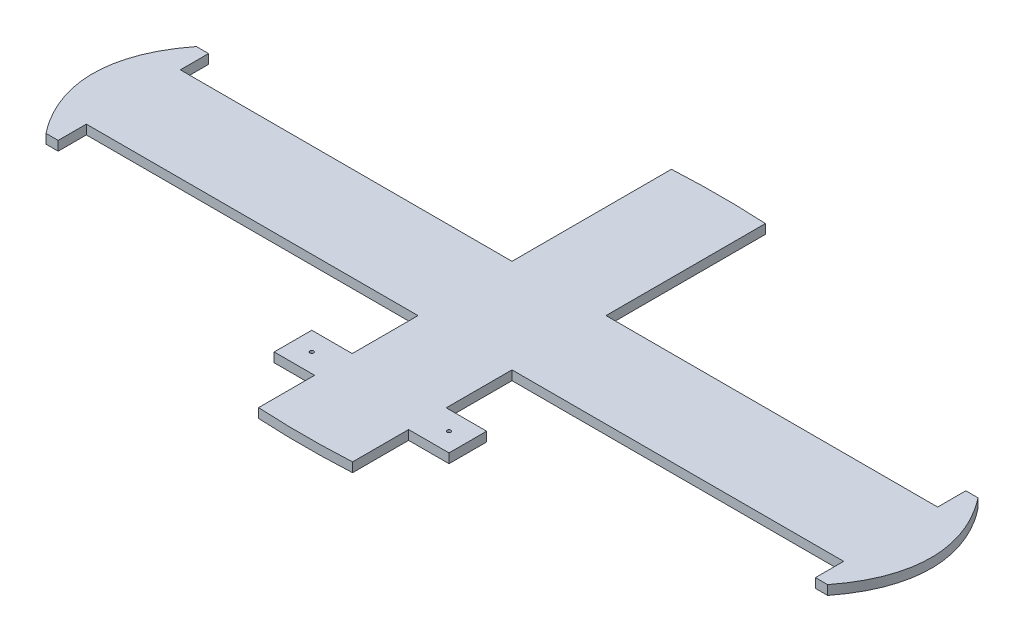
ISO-10303-21;
HEADER;
FILE_DESCRIPTION(('STEP AP214'),'2;1');
FILE_NAME('part.step','',(''),(''),'','','');
FILE_SCHEMA(('AUTOMOTIVE_DESIGN { 1 0 10303 214 1 1 1 1 }'));
ENDSEC;
DATA;
#1=APPLICATION_CONTEXT('core data for automotive mechanical design processes');
#2=APPLICATION_PROTOCOL_DEFINITION('international standard','automotive_design',2000,#1);
#3=PRODUCT_CONTEXT('',#1,'mechanical');
#4=PRODUCT('Part','Part','',(#3));
#5=PRODUCT_RELATED_PRODUCT_CATEGORY('part','',(#4));
#6=PRODUCT_DEFINITION_FORMATION('','',#4);
#7=PRODUCT_DEFINITION_CONTEXT('part definition',#1,'design');
#8=PRODUCT_DEFINITION('design','',#6,#7);
#9=PRODUCT_DEFINITION_SHAPE('','',#8);
#10=(LENGTH_UNIT() NAMED_UNIT(*) SI_UNIT(.MILLI.,.METRE.));
#11=(NAMED_UNIT(*) PLANE_ANGLE_UNIT() SI_UNIT($,.RADIAN.));
#12=(NAMED_UNIT(*) SI_UNIT($,.STERADIAN.) SOLID_ANGLE_UNIT());
#13=UNCERTAINTY_MEASURE_WITH_UNIT(LENGTH_MEASURE(1.E-05),#10,'distance_accuracy_value','');
#14=(GEOMETRIC_REPRESENTATION_CONTEXT(3) GLOBAL_UNCERTAINTY_ASSIGNED_CONTEXT((#13)) GLOBAL_UNIT_ASSIGNED_CONTEXT((#10,
#11,#12)) REPRESENTATION_CONTEXT('',''));
#15=CARTESIAN_POINT('',(0.,0.,0.));
#16=DIRECTION('',(0.,0.,1.));
#17=DIRECTION('',(1.,0.,0.));
#18=AXIS2_PLACEMENT_3D('',#15,#16,#17);
#19=CARTESIAN_POINT('',(24.9999999999011,5.,0.));
#20=DIRECTION('',(1.,0.,0.));
#21=DIRECTION('',(0.,0.,-1.));
#22=AXIS2_PLACEMENT_3D('',#19,#20,#21);
#23=PLANE('',#22);
#24=DIRECTION('',(0.,1.,0.));
#25=VECTOR('',#24,1.);
#26=CARTESIAN_POINT('',(24.9999999999011,0.,80.));
#27=LINE('',#26,#25);
#28=CARTESIAN_POINT('',(24.9999999999011,0.,80.));
#29=VERTEX_POINT('',#28);
#30=CARTESIAN_POINT('',(24.9999999999011,5.,80.));
#31=VERTEX_POINT('',#30);
#32=EDGE_CURVE('E266',#29,#31,#27,.T.);
#33=ORIENTED_EDGE('',*,*,#32,.T.);
#34=DIRECTION('',(0.,0.,1.));
#35=VECTOR('',#34,1.);
#36=CARTESIAN_POINT('',(24.9999999999011,5.,0.));
#37=LINE('',#36,#35);
#38=CARTESIAN_POINT('',(24.9999999999011,5.,109.803415805088));
#39=VERTEX_POINT('',#38);
#40=EDGE_CURVE('E359',#31,#39,#37,.T.);
#41=ORIENTED_EDGE('',*,*,#40,.T.);
#42=DIRECTION('',(0.,-1.,0.));
#43=VECTOR('',#42,1.);
#44=CARTESIAN_POINT('',(24.9999999999011,5.,109.803415805088));
#45=LINE('',#44,#43);
#46=CARTESIAN_POINT('',(24.9999999999011,0.,109.803415805088));
#47=VERTEX_POINT('',#46);
#48=EDGE_CURVE('E411',#39,#47,#45,.T.);
#49=ORIENTED_EDGE('',*,*,#48,.T.);
#50=DIRECTION('',(0.,0.,1.));
#51=VECTOR('',#50,1.);
#52=CARTESIAN_POINT('',(24.9999999999011,0.,0.));
#53=LINE('',#52,#51);
#54=EDGE_CURVE('E409',#29,#47,#53,.T.);
#55=ORIENTED_EDGE('',*,*,#54,.F.);
#56=EDGE_LOOP('',(#33,#41,#49,#55));
#57=FACE_BOUND('',#56,.T.);
#58=ADVANCED_FACE('F39',(#57),#23,.T.);
#59=CARTESIAN_POINT('',(-24.999999999963,5.,0.));
#60=DIRECTION('',(1.,0.,0.));
#61=DIRECTION('',(0.,0.,-1.));
#62=AXIS2_PLACEMENT_3D('',#59,#60,#61);
#63=PLANE('',#62);
#64=DIRECTION('',(0.,0.,1.));
#65=VECTOR('',#64,1.);
#66=CARTESIAN_POINT('',(-24.999999999963,5.,0.));
#67=LINE('',#66,#65);
#68=CARTESIAN_POINT('',(-24.999999999963,5.,80.));
#69=VERTEX_POINT('',#68);
#70=CARTESIAN_POINT('',(-24.999999999963,5.,109.803415805084));
#71=VERTEX_POINT('',#70);
#72=EDGE_CURVE('E62',#69,#71,#67,.T.);
#73=ORIENTED_EDGE('',*,*,#72,.F.);
#74=DIRECTION('',(0.,1.,0.));
#75=VECTOR('',#74,1.);
#76=CARTESIAN_POINT('',(-24.999999999963,0.,80.));
#77=LINE('',#76,#75);
#78=CARTESIAN_POINT('',(-24.999999999963,0.,80.));
#79=VERTEX_POINT('',#78);
#80=EDGE_CURVE('E294',#79,#69,#77,.T.);
#81=ORIENTED_EDGE('',*,*,#80,.F.);
#82=DIRECTION('',(0.,0.,1.));
#83=VECTOR('',#82,1.);
#84=CARTESIAN_POINT('',(-24.999999999963,0.,0.));
#85=LINE('',#84,#83);
#86=CARTESIAN_POINT('',(-24.999999999963,0.,109.803415805084));
#87=VERTEX_POINT('',#86);
#88=EDGE_CURVE('E511',#79,#87,#85,.T.);
#89=ORIENTED_EDGE('',*,*,#88,.T.);
#90=DIRECTION('',(0.,-1.,0.));
#91=VECTOR('',#90,1.);
#92=CARTESIAN_POINT('',(-24.999999999963,5.,109.803415805084));
#93=LINE('',#92,#91);
#94=EDGE_CURVE('E458',#71,#87,#93,.T.);
#95=ORIENTED_EDGE('',*,*,#94,.F.);
#96=EDGE_LOOP('',(#73,#81,#89,#95));
#97=FACE_BOUND('',#96,.T.);
#98=ADVANCED_FACE('F375',(#97),#63,.F.);
#99=CARTESIAN_POINT('',(25.000000000037,5.,0.));
#100=DIRECTION('',(-1.,0.,0.));
#101=DIRECTION('',(0.,0.,1.));
#102=AXIS2_PLACEMENT_3D('',#99,#100,#101);
#103=PLANE('',#102);
#104=DIRECTION('',(0.,0.,-1.));
#105=VECTOR('',#104,1.);
#106=CARTESIAN_POINT('',(25.000000000037,0.,0.));
#107=LINE('',#106,#105);
#108=CARTESIAN_POINT('',(25.000000000037,0.,-24.9999999999231));
#109=VERTEX_POINT('',#108);
#110=CARTESIAN_POINT('',(25.000000000037,0.,-109.80341580508));
#111=VERTEX_POINT('',#110);
#112=EDGE_CURVE('E296',#109,#111,#107,.T.);
#113=ORIENTED_EDGE('',*,*,#112,.T.);
#114=DIRECTION('',(0.,-1.,0.));
#115=VECTOR('',#114,1.);
#116=CARTESIAN_POINT('',(25.000000000037,5.,-109.80341580508));
#117=LINE('',#116,#115);
#118=CARTESIAN_POINT('',(25.000000000037,5.,-109.80341580508));
#119=VERTEX_POINT('',#118);
#120=EDGE_CURVE('E11',#119,#111,#117,.T.);
#121=ORIENTED_EDGE('',*,*,#120,.F.);
#122=DIRECTION('',(0.,0.,-1.));
#123=VECTOR('',#122,1.);
#124=CARTESIAN_POINT('',(25.000000000037,5.,0.));
#125=LINE('',#124,#123);
#126=CARTESIAN_POINT('',(25.000000000037,5.,-24.9999999999231));
#127=VERTEX_POINT('',#126);
#128=EDGE_CURVE('E302',#127,#119,#125,.T.);
#129=ORIENTED_EDGE('',*,*,#128,.F.);
#130=DIRECTION('',(0.,-1.,0.));
#131=VECTOR('',#130,1.);
#132=CARTESIAN_POINT('',(25.000000000037,5.,-24.9999999999231));
#133=LINE('',#132,#131);
#134=EDGE_CURVE('E437',#127,#109,#133,.T.);
#135=ORIENTED_EDGE('',*,*,#134,.T.);
#136=EDGE_LOOP('',(#113,#121,#129,#135));
#137=FACE_BOUND('',#136,.T.);
#138=ADVANCED_FACE('F41',(#137),#103,.F.);
#139=CARTESIAN_POINT('',(0.,5.,0.));
#140=DIRECTION('',(0.,1.,0.));
#141=DIRECTION('',(-1.,0.,0.));
#142=AXIS2_PLACEMENT_3D('',#139,#140,#141);
#143=ELLIPSE('',#142,223.,110.5);
#144=DIRECTION('',(0.,-1.,0.));
#145=VECTOR('',#144,1.);
#146=SURFACE_OF_LINEAR_EXTRUSION('',#143,#145);
#147=CARTESIAN_POINT('',(0.,0.,0.));
#148=DIRECTION('',(0.,1.,0.));
#149=DIRECTION('',(-1.,0.,0.));
#150=AXIS2_PLACEMENT_3D('',#147,#148,#149);
#151=ELLIPSE('',#150,223.,110.5);
#152=CARTESIAN_POINT('',(-24.9999999999629,0.,-109.803415805084));
#153=VERTEX_POINT('',#152);
#154=EDGE_CURVE('E485',#111,#153,#151,.T.);
#155=ORIENTED_EDGE('',*,*,#154,.T.);
#156=DIRECTION('',(0.,-1.,0.));
#157=VECTOR('',#156,1.);
#158=CARTESIAN_POINT('',(-24.9999999999629,5.,-109.803415805084));
#159=LINE('',#158,#157);
#160=CARTESIAN_POINT('',(-24.9999999999629,5.,-109.803415805084));
#161=VERTEX_POINT('',#160);
#162=EDGE_CURVE('E47',#161,#153,#159,.T.);
#163=ORIENTED_EDGE('',*,*,#162,.F.);
#164=EDGE_CURVE('E305',#119,#161,#143,.T.);
#165=ORIENTED_EDGE('',*,*,#164,.F.);
#166=ORIENTED_EDGE('',*,*,#120,.T.);
#167=EDGE_LOOP('',(#155,#163,#165,#166));
#168=FACE_BOUND('',#167,.T.);
#169=ADVANCED_FACE('F311',(#168),#146,.F.);
#170=CARTESIAN_POINT('',(-24.999999999963,5.,0.));
#171=DIRECTION('',(-1.,0.,0.));
#172=DIRECTION('',(0.,0.,1.));
#173=AXIS2_PLACEMENT_3D('',#170,#171,#172);
#174=PLANE('',#173);
#175=DIRECTION('',(0.,0.,-1.));
#176=VECTOR('',#175,1.);
#177=CARTESIAN_POINT('',(-24.999999999963,0.,0.));
#178=LINE('',#177,#176);
#179=CARTESIAN_POINT('',(-24.999999999963,0.,-24.9999999999231));
#180=VERTEX_POINT('',#179);
#181=EDGE_CURVE('E483',#180,#153,#178,.T.);
#182=ORIENTED_EDGE('',*,*,#181,.F.);
#183=DIRECTION('',(0.,-1.,0.));
#184=VECTOR('',#183,1.);
#185=CARTESIAN_POINT('',(-24.999999999963,5.,-24.9999999999231));
#186=LINE('',#185,#184);
#187=CARTESIAN_POINT('',(-24.999999999963,5.,-24.9999999999231));
#188=VERTEX_POINT('',#187);
#189=EDGE_CURVE('E477',#188,#180,#186,.T.);
#190=ORIENTED_EDGE('',*,*,#189,.F.);
#191=DIRECTION('',(0.,0.,-1.));
#192=VECTOR('',#191,1.);
#193=CARTESIAN_POINT('',(-24.999999999963,5.,0.));
#194=LINE('',#193,#192);
#195=EDGE_CURVE('E309',#188,#161,#194,.T.);
#196=ORIENTED_EDGE('',*,*,#195,.T.);
#197=ORIENTED_EDGE('',*,*,#162,.T.);
#198=EDGE_LOOP('',(#182,#190,#196,#197));
#199=FACE_BOUND('',#198,.T.);
#200=ADVANCED_FACE('F314',(#199),#174,.T.);
#201=CARTESIAN_POINT('',(0.,5.,-24.9999999999231));
#202=DIRECTION('',(0.,0.,1.));
#203=DIRECTION('',(1.,0.,0.));
#204=AXIS2_PLACEMENT_3D('',#201,#202,#203);
#205=PLANE('',#204);
#206=DIRECTION('',(-1.,0.,0.));
#207=VECTOR('',#206,1.);
#208=CARTESIAN_POINT('',(0.,0.,-24.9999999999231));
#209=LINE('',#208,#207);
#210=CARTESIAN_POINT('',(-201.409203425071,0.,-24.9999999999231));
#211=VERTEX_POINT('',#210);
#212=EDGE_CURVE('E492',#180,#211,#209,.T.);
#213=ORIENTED_EDGE('',*,*,#212,.T.);
#214=DIRECTION('',(0.,-1.,0.));
#215=VECTOR('',#214,1.);
#216=CARTESIAN_POINT('',(-201.409203425071,5.,-24.9999999999231));
#217=LINE('',#216,#215);
#218=CARTESIAN_POINT('',(-201.409203425071,5.,-24.9999999999231));
#219=VERTEX_POINT('',#218);
#220=EDGE_CURVE('E475',#219,#211,#217,.T.);
#221=ORIENTED_EDGE('',*,*,#220,.F.);
#222=DIRECTION('',(-1.,0.,0.));
#223=VECTOR('',#222,1.);
#224=CARTESIAN_POINT('',(0.,5.,-24.9999999999231));
#225=LINE('',#224,#223);
#226=EDGE_CURVE('E545',#188,#219,#225,.T.);
#227=ORIENTED_EDGE('',*,*,#226,.F.);
#228=ORIENTED_EDGE('',*,*,#189,.T.);
#229=EDGE_LOOP('',(#213,#221,#227,#228));
#230=FACE_BOUND('',#229,.T.);
#231=ADVANCED_FACE('F318',(#230),#205,.F.);
#232=CARTESIAN_POINT('',(-201.409203425071,5.,0.));
#233=DIRECTION('',(1.,0.,0.));
#234=DIRECTION('',(0.,0.,-1.));
#235=AXIS2_PLACEMENT_3D('',#232,#233,#234);
#236=PLANE('',#235);
#237=DIRECTION('',(0.,0.,1.));
#238=VECTOR('',#237,1.);
#239=CARTESIAN_POINT('',(-201.409203425071,0.,0.));
#240=LINE('',#239,#238);
#241=CARTESIAN_POINT('',(-201.409203425071,0.,-39.9999999999144));
#242=VERTEX_POINT('',#241);
#243=EDGE_CURVE('E494',#242,#211,#240,.T.);
#244=ORIENTED_EDGE('',*,*,#243,.F.);
#245=DIRECTION('',(0.,-1.,0.));
#246=VECTOR('',#245,1.);
#247=CARTESIAN_POINT('',(-201.409203425071,5.,-39.9999999999144));
#248=LINE('',#247,#246);
#249=CARTESIAN_POINT('',(-201.409203425071,5.,-39.9999999999144));
#250=VERTEX_POINT('',#249);
#251=EDGE_CURVE('E473',#250,#242,#248,.T.);
#252=ORIENTED_EDGE('',*,*,#251,.F.);
#253=DIRECTION('',(0.,0.,1.));
#254=VECTOR('',#253,1.);
#255=CARTESIAN_POINT('',(-201.409203425071,5.,0.));
#256=LINE('',#255,#254);
#257=EDGE_CURVE('E543',#250,#219,#256,.T.);
#258=ORIENTED_EDGE('',*,*,#257,.T.);
#259=ORIENTED_EDGE('',*,*,#220,.T.);
#260=EDGE_LOOP('',(#244,#252,#258,#259));
#261=FACE_BOUND('',#260,.T.);
#262=ADVANCED_FACE('F322',(#261),#236,.T.);
#263=CARTESIAN_POINT('',(3.00417745849696E-13,5.,-39.9999999999129));
#264=DIRECTION('',(0.,0.,1.));
#265=DIRECTION('',(1.,0.,0.));
#266=AXIS2_PLACEMENT_3D('',#263,#264,#265);
#267=PLANE('',#266);
#268=DIRECTION('',(-1.,0.,0.));
#269=VECTOR('',#268,1.);
#270=CARTESIAN_POINT('',(3.00417745849696E-13,0.,-39.9999999999129));
#271=LINE('',#270,#269);
#272=CARTESIAN_POINT('',(-207.876498782723,0.,-39.9999999999145));
#273=VERTEX_POINT('',#272);
#274=EDGE_CURVE('E499',#242,#273,#271,.T.);
#275=ORIENTED_EDGE('',*,*,#274,.T.);
#276=DIRECTION('',(0.,-1.,0.));
#277=VECTOR('',#276,1.);
#278=CARTESIAN_POINT('',(-207.876498782723,5.,-39.9999999999145));
#279=LINE('',#278,#277);
#280=CARTESIAN_POINT('',(-207.876498782723,5.,-39.9999999999145));
#281=VERTEX_POINT('',#280);
#282=EDGE_CURVE('E470',#281,#273,#279,.T.);
#283=ORIENTED_EDGE('',*,*,#282,.F.);
#284=DIRECTION('',(-1.,0.,0.));
#285=VECTOR('',#284,1.);
#286=CARTESIAN_POINT('',(3.00417745849696E-13,5.,-39.9999999999129));
#287=LINE('',#286,#285);
#288=EDGE_CURVE('E343',#250,#281,#287,.T.);
#289=ORIENTED_EDGE('',*,*,#288,.F.);
#290=ORIENTED_EDGE('',*,*,#251,.T.);
#291=EDGE_LOOP('',(#275,#283,#289,#290));
#292=FACE_BOUND('',#291,.T.);
#293=ADVANCED_FACE('F326',(#292),#267,.F.);
#294=CARTESIAN_POINT('',(0.,5.,0.));
#295=DIRECTION('',(0.,1.,0.));
#296=DIRECTION('',(-1.,0.,0.));
#297=AXIS2_PLACEMENT_3D('',#294,#295,#296);
#298=ELLIPSE('',#297,223.,110.5);
#299=DIRECTION('',(0.,-1.,0.));
#300=VECTOR('',#299,1.);
#301=SURFACE_OF_LINEAR_EXTRUSION('',#298,#300);
#302=CARTESIAN_POINT('',(0.,0.,0.));
#303=DIRECTION('',(0.,1.,0.));
#304=DIRECTION('',(-1.,0.,0.));
#305=AXIS2_PLACEMENT_3D('',#302,#303,#304);
#306=ELLIPSE('',#305,223.,110.5);
#307=CARTESIAN_POINT('',(-207.876498782656,0.,40.));
#308=VERTEX_POINT('',#307);
#309=EDGE_CURVE('E501',#273,#308,#306,.T.);
#310=ORIENTED_EDGE('',*,*,#309,.T.);
#311=DIRECTION('',(0.,-1.,0.));
#312=VECTOR('',#311,1.);
#313=CARTESIAN_POINT('',(-207.876498782656,5.,40.));
#314=LINE('',#313,#312);
#315=CARTESIAN_POINT('',(-207.876498782656,5.,40.));
#316=VERTEX_POINT('',#315);
#317=EDGE_CURVE('E467',#316,#308,#314,.T.);
#318=ORIENTED_EDGE('',*,*,#317,.F.);
#319=EDGE_CURVE('E338',#281,#316,#298,.T.);
#320=ORIENTED_EDGE('',*,*,#319,.F.);
#321=ORIENTED_EDGE('',*,*,#282,.T.);
#322=EDGE_LOOP('',(#310,#318,#320,#321));
#323=FACE_BOUND('',#322,.T.);
#324=ADVANCED_FACE('F330',(#323),#301,.F.);
#325=CARTESIAN_POINT('',(-2.14584104181053E-13,5.,40.0000000000011));
#326=DIRECTION('',(0.,0.,-1.));
#327=DIRECTION('',(-1.,0.,0.));
#328=AXIS2_PLACEMENT_3D('',#325,#326,#327);
#329=PLANE('',#328);
#330=DIRECTION('',(1.,0.,0.));
#331=VECTOR('',#330,1.);
#332=CARTESIAN_POINT('',(-2.14584104181053E-13,0.,40.0000000000011));
#333=LINE('',#332,#331);
#334=CARTESIAN_POINT('',(-201.409203425071,0.,40.));
#335=VERTEX_POINT('',#334);
#336=EDGE_CURVE('E503',#308,#335,#333,.T.);
#337=ORIENTED_EDGE('',*,*,#336,.T.);
#338=DIRECTION('',(0.,-1.,0.));
#339=VECTOR('',#338,1.);
#340=CARTESIAN_POINT('',(-201.409203425071,5.,40.));
#341=LINE('',#340,#339);
#342=CARTESIAN_POINT('',(-201.409203425071,5.,40.));
#343=VERTEX_POINT('',#342);
#344=EDGE_CURVE('E465',#343,#335,#341,.T.);
#345=ORIENTED_EDGE('',*,*,#344,.F.);
#346=DIRECTION('',(1.,0.,0.));
#347=VECTOR('',#346,1.);
#348=CARTESIAN_POINT('',(-2.14584104181053E-13,5.,40.0000000000011));
#349=LINE('',#348,#347);
#350=EDGE_CURVE('E342',#316,#343,#349,.T.);
#351=ORIENTED_EDGE('',*,*,#350,.F.);
#352=ORIENTED_EDGE('',*,*,#317,.T.);
#353=EDGE_LOOP('',(#337,#345,#351,#352));
#354=FACE_BOUND('',#353,.T.);
#355=ADVANCED_FACE('F335',(#354),#329,.F.);
#356=CARTESIAN_POINT('',(-201.409203425071,5.,0.));
#357=DIRECTION('',(1.,0.,0.));
#358=DIRECTION('',(0.,0.,-1.));
#359=AXIS2_PLACEMENT_3D('',#356,#357,#358);
#360=PLANE('',#359);
#361=DIRECTION('',(0.,0.,1.));
#362=VECTOR('',#361,1.);
#363=CARTESIAN_POINT('',(-201.409203425071,0.,0.));
#364=LINE('',#363,#362);
#365=CARTESIAN_POINT('',(-201.409203425071,0.,25.0000000000769));
#366=VERTEX_POINT('',#365);
#367=EDGE_CURVE('E506',#366,#335,#364,.T.);
#368=ORIENTED_EDGE('',*,*,#367,.F.);
#369=DIRECTION('',(0.,-1.,0.));
#370=VECTOR('',#369,1.);
#371=CARTESIAN_POINT('',(-201.409203425071,5.,25.0000000000769));
#372=LINE('',#371,#370);
#373=CARTESIAN_POINT('',(-201.409203425071,5.,25.0000000000769));
#374=VERTEX_POINT('',#373);
#375=EDGE_CURVE('E463',#374,#366,#372,.T.);
#376=ORIENTED_EDGE('',*,*,#375,.F.);
#377=DIRECTION('',(0.,0.,1.));
#378=VECTOR('',#377,1.);
#379=CARTESIAN_POINT('',(-201.409203425071,5.,0.));
#380=LINE('',#379,#378);
#381=EDGE_CURVE('E346',#374,#343,#380,.T.);
#382=ORIENTED_EDGE('',*,*,#381,.T.);
#383=ORIENTED_EDGE('',*,*,#344,.T.);
#384=EDGE_LOOP('',(#368,#376,#382,#383));
#385=FACE_BOUND('',#384,.T.);
#386=ADVANCED_FACE('F377',(#385),#360,.T.);
#387=CARTESIAN_POINT('',(0.,5.,25.0000000000769));
#388=DIRECTION('',(0.,0.,1.));
#389=DIRECTION('',(1.,0.,0.));
#390=AXIS2_PLACEMENT_3D('',#387,#388,#389);
#391=PLANE('',#390);
#392=DIRECTION('',(-1.,0.,0.));
#393=VECTOR('',#392,1.);
#394=CARTESIAN_POINT('',(0.,0.,25.0000000000769));
#395=LINE('',#394,#393);
#396=CARTESIAN_POINT('',(-24.999999999963,0.,25.0000000000769));
#397=VERTEX_POINT('',#396);
#398=EDGE_CURVE('E509',#397,#366,#395,.T.);
#399=ORIENTED_EDGE('',*,*,#398,.F.);
#400=DIRECTION('',(0.,-1.,0.));
#401=VECTOR('',#400,1.);
#402=CARTESIAN_POINT('',(-24.999999999963,5.,25.0000000000769));
#403=LINE('',#402,#401);
#404=CARTESIAN_POINT('',(-24.999999999963,5.,25.0000000000769));
#405=VERTEX_POINT('',#404);
#406=EDGE_CURVE('E461',#405,#397,#403,.T.);
#407=ORIENTED_EDGE('',*,*,#406,.F.);
#408=DIRECTION('',(-1.,0.,0.));
#409=VECTOR('',#408,1.);
#410=CARTESIAN_POINT('',(0.,5.,25.0000000000769));
#411=LINE('',#410,#409);
#412=EDGE_CURVE('E349',#405,#374,#411,.T.);
#413=ORIENTED_EDGE('',*,*,#412,.T.);
#414=ORIENTED_EDGE('',*,*,#375,.T.);
#415=EDGE_LOOP('',(#399,#407,#413,#414));
#416=FACE_BOUND('',#415,.T.);
#417=ADVANCED_FACE('F373',(#416),#391,.T.);
#418=CARTESIAN_POINT('',(-24.999999999963,0.,60.));
#419=VERTEX_POINT('',#418);
#420=EDGE_CURVE('E417',#397,#419,#85,.T.);
#421=ORIENTED_EDGE('',*,*,#420,.T.);
#422=DIRECTION('',(0.,1.,0.));
#423=VECTOR('',#422,1.);
#424=CARTESIAN_POINT('',(-24.999999999963,0.,60.));
#425=LINE('',#424,#423);
#426=CARTESIAN_POINT('',(-24.999999999963,5.,60.));
#427=VERTEX_POINT('',#426);
#428=EDGE_CURVE('E283',#419,#427,#425,.T.);
#429=ORIENTED_EDGE('',*,*,#428,.T.);
#430=EDGE_CURVE('E352',#405,#427,#67,.T.);
#431=ORIENTED_EDGE('',*,*,#430,.F.);
#432=ORIENTED_EDGE('',*,*,#406,.T.);
#433=EDGE_LOOP('',(#421,#429,#431,#432));
#434=FACE_BOUND('',#433,.T.);
#435=ADVANCED_FACE('F368',(#434),#63,.F.);
#436=CARTESIAN_POINT('',(0.,5.,0.));
#437=DIRECTION('',(0.,1.,0.));
#438=DIRECTION('',(-1.,0.,0.));
#439=AXIS2_PLACEMENT_3D('',#436,#437,#438);
#440=ELLIPSE('',#439,223.,110.5);
#441=DIRECTION('',(0.,-1.,0.));
#442=VECTOR('',#441,1.);
#443=SURFACE_OF_LINEAR_EXTRUSION('',#440,#442);
#444=CARTESIAN_POINT('',(0.,0.,0.));
#445=DIRECTION('',(0.,1.,0.));
#446=DIRECTION('',(-1.,0.,0.));
#447=AXIS2_PLACEMENT_3D('',#444,#445,#446);
#448=ELLIPSE('',#447,223.,110.5);
#449=EDGE_CURVE('E414',#87,#47,#448,.T.);
#450=ORIENTED_EDGE('',*,*,#449,.T.);
#451=ORIENTED_EDGE('',*,*,#48,.F.);
#452=EDGE_CURVE('E355',#71,#39,#440,.T.);
#453=ORIENTED_EDGE('',*,*,#452,.F.);
#454=ORIENTED_EDGE('',*,*,#94,.T.);
#455=EDGE_LOOP('',(#450,#451,#453,#454));
#456=FACE_BOUND('',#455,.T.);
#457=ADVANCED_FACE('F363',(#456),#443,.F.);
#458=DIRECTION('',(0.,1.,0.));
#459=VECTOR('',#458,1.);
#460=CARTESIAN_POINT('',(24.9999999999011,0.,60.));
#461=LINE('',#460,#459);
#462=CARTESIAN_POINT('',(24.9999999999011,0.,60.));
#463=VERTEX_POINT('',#462);
#464=CARTESIAN_POINT('',(24.9999999999011,5.,60.));
#465=VERTEX_POINT('',#464);
#466=EDGE_CURVE('E236',#463,#465,#461,.T.);
#467=ORIENTED_EDGE('',*,*,#466,.F.);
#468=CARTESIAN_POINT('',(24.9999999999011,0.,25.0000000000769));
#469=VERTEX_POINT('',#468);
#470=EDGE_CURVE('E245',#469,#463,#53,.T.);
#471=ORIENTED_EDGE('',*,*,#470,.F.);
#472=DIRECTION('',(0.,-1.,0.));
#473=VECTOR('',#472,1.);
#474=CARTESIAN_POINT('',(24.9999999999011,5.,25.0000000000769));
#475=LINE('',#474,#473);
#476=CARTESIAN_POINT('',(24.9999999999011,5.,25.0000000000769));
#477=VERTEX_POINT('',#476);
#478=EDGE_CURVE('E455',#477,#469,#475,.T.);
#479=ORIENTED_EDGE('',*,*,#478,.F.);
#480=EDGE_CURVE('E360',#477,#465,#37,.T.);
#481=ORIENTED_EDGE('',*,*,#480,.T.);
#482=EDGE_LOOP('',(#467,#471,#479,#481));
#483=FACE_BOUND('',#482,.T.);
#484=ADVANCED_FACE('F367',(#483),#23,.T.);
#485=CARTESIAN_POINT('',(0.,5.,25.0000000000769));
#486=DIRECTION('',(0.,0.,-1.));
#487=DIRECTION('',(-1.,0.,0.));
#488=AXIS2_PLACEMENT_3D('',#485,#486,#487);
#489=PLANE('',#488);
#490=DIRECTION('',(1.,0.,0.));
#491=VECTOR('',#490,1.);
#492=CARTESIAN_POINT('',(0.,0.,25.0000000000769));
#493=LINE('',#492,#491);
#494=CARTESIAN_POINT('',(201.409203427969,0.,25.0000000000769));
#495=VERTEX_POINT('',#494);
#496=EDGE_CURVE('E416',#469,#495,#493,.T.);
#497=ORIENTED_EDGE('',*,*,#496,.T.);
#498=DIRECTION('',(0.,-1.,0.));
#499=VECTOR('',#498,1.);
#500=CARTESIAN_POINT('',(201.409203427969,5.,25.0000000000769));
#501=LINE('',#500,#499);
#502=CARTESIAN_POINT('',(201.409203427969,5.,25.0000000000769));
#503=VERTEX_POINT('',#502);
#504=EDGE_CURVE('E452',#503,#495,#501,.T.);
#505=ORIENTED_EDGE('',*,*,#504,.F.);
#506=DIRECTION('',(1.,0.,0.));
#507=VECTOR('',#506,1.);
#508=CARTESIAN_POINT('',(0.,5.,25.0000000000769));
#509=LINE('',#508,#507);
#510=EDGE_CURVE('E593',#477,#503,#509,.T.);
#511=ORIENTED_EDGE('',*,*,#510,.F.);
#512=ORIENTED_EDGE('',*,*,#478,.T.);
#513=EDGE_LOOP('',(#497,#505,#511,#512));
#514=FACE_BOUND('',#513,.T.);
#515=ADVANCED_FACE('F392',(#514),#489,.F.);
#516=CARTESIAN_POINT('',(201.409203427969,5.,0.));
#517=DIRECTION('',(1.,0.,0.));
#518=DIRECTION('',(0.,0.,-1.));
#519=AXIS2_PLACEMENT_3D('',#516,#517,#518);
#520=PLANE('',#519);
#521=DIRECTION('',(0.,0.,1.));
#522=VECTOR('',#521,1.);
#523=CARTESIAN_POINT('',(201.409203427969,0.,0.));
#524=LINE('',#523,#522);
#525=CARTESIAN_POINT('',(201.409203427969,0.,40.));
#526=VERTEX_POINT('',#525);
#527=EDGE_CURVE('E422',#495,#526,#524,.T.);
#528=ORIENTED_EDGE('',*,*,#527,.T.);
#529=DIRECTION('',(0.,-1.,0.));
#530=VECTOR('',#529,1.);
#531=CARTESIAN_POINT('',(201.409203427969,5.,40.));
#532=LINE('',#531,#530);
#533=CARTESIAN_POINT('',(201.409203427969,5.,40.));
#534=VERTEX_POINT('',#533);
#535=EDGE_CURVE('E449',#534,#526,#532,.T.);
#536=ORIENTED_EDGE('',*,*,#535,.F.);
#537=DIRECTION('',(0.,0.,1.));
#538=VECTOR('',#537,1.);
#539=CARTESIAN_POINT('',(201.409203427969,5.,0.));
#540=LINE('',#539,#538);
#541=EDGE_CURVE('E592',#503,#534,#540,.T.);
#542=ORIENTED_EDGE('',*,*,#541,.F.);
#543=ORIENTED_EDGE('',*,*,#504,.T.);
#544=EDGE_LOOP('',(#528,#536,#542,#543));
#545=FACE_BOUND('',#544,.T.);
#546=ADVANCED_FACE('F397',(#545),#520,.F.);
#547=CARTESIAN_POINT('',(0.,5.,40.0000000000002));
#548=DIRECTION('',(0.,0.,-1.));
#549=DIRECTION('',(-1.,0.,0.));
#550=AXIS2_PLACEMENT_3D('',#547,#548,#549);
#551=PLANE('',#550);
#552=DIRECTION('',(1.,0.,0.));
#553=VECTOR('',#552,1.);
#554=CARTESIAN_POINT('',(0.,0.,40.0000000000002));
#555=LINE('',#554,#553);
#556=CARTESIAN_POINT('',(207.876498782656,0.,40.));
#557=VERTEX_POINT('',#556);
#558=EDGE_CURVE('E424',#526,#557,#555,.T.);
#559=ORIENTED_EDGE('',*,*,#558,.T.);
#560=DIRECTION('',(0.,-1.,0.));
#561=VECTOR('',#560,1.);
#562=CARTESIAN_POINT('',(207.876498782656,5.,40.));
#563=LINE('',#562,#561);
#564=CARTESIAN_POINT('',(207.876498782656,5.,40.));
#565=VERTEX_POINT('',#564);
#566=EDGE_CURVE('E446',#565,#557,#563,.T.);
#567=ORIENTED_EDGE('',*,*,#566,.F.);
#568=DIRECTION('',(1.,0.,0.));
#569=VECTOR('',#568,1.);
#570=CARTESIAN_POINT('',(0.,5.,40.0000000000002));
#571=LINE('',#570,#569);
#572=EDGE_CURVE('E561',#534,#565,#571,.T.);
#573=ORIENTED_EDGE('',*,*,#572,.F.);
#574=ORIENTED_EDGE('',*,*,#535,.T.);
#575=EDGE_LOOP('',(#559,#567,#573,#574));
#576=FACE_BOUND('',#575,.T.);
#577=ADVANCED_FACE('F569',(#576),#551,.F.);
#578=CARTESIAN_POINT('',(0.,5.,0.));
#579=DIRECTION('',(0.,1.,0.));
#580=DIRECTION('',(-1.,0.,0.));
#581=AXIS2_PLACEMENT_3D('',#578,#579,#580);
#582=ELLIPSE('',#581,223.,110.5);
#583=DIRECTION('',(0.,-1.,0.));
#584=VECTOR('',#583,1.);
#585=SURFACE_OF_LINEAR_EXTRUSION('',#582,#584);
#586=CARTESIAN_POINT('',(0.,0.,0.));
#587=DIRECTION('',(0.,1.,0.));
#588=DIRECTION('',(-1.,0.,0.));
#589=AXIS2_PLACEMENT_3D('',#586,#587,#588);
#590=ELLIPSE('',#589,223.,110.5);
#591=CARTESIAN_POINT('',(207.876498782723,0.,-39.9999999999144));
#592=VERTEX_POINT('',#591);
#593=EDGE_CURVE('E426',#557,#592,#590,.T.);
#594=ORIENTED_EDGE('',*,*,#593,.T.);
#595=DIRECTION('',(0.,-1.,0.));
#596=VECTOR('',#595,1.);
#597=CARTESIAN_POINT('',(207.876498782723,5.,-39.9999999999144));
#598=LINE('',#597,#596);
#599=CARTESIAN_POINT('',(207.876498782723,5.,-39.9999999999144));
#600=VERTEX_POINT('',#599);
#601=EDGE_CURVE('E444',#600,#592,#598,.T.);
#602=ORIENTED_EDGE('',*,*,#601,.F.);
#603=EDGE_CURVE('E558',#565,#600,#582,.T.);
#604=ORIENTED_EDGE('',*,*,#603,.F.);
#605=ORIENTED_EDGE('',*,*,#566,.T.);
#606=EDGE_LOOP('',(#594,#602,#604,#605));
#607=FACE_BOUND('',#606,.T.);
#608=ADVANCED_FACE('F564',(#607),#585,.F.);
#609=CARTESIAN_POINT('',(0.,5.,-39.999999999914));
#610=DIRECTION('',(0.,0.,-1.));
#611=DIRECTION('',(-1.,0.,0.));
#612=AXIS2_PLACEMENT_3D('',#609,#610,#611);
#613=PLANE('',#612);
#614=DIRECTION('',(1.,0.,0.));
#615=VECTOR('',#614,1.);
#616=CARTESIAN_POINT('',(0.,0.,-39.999999999914));
#617=LINE('',#616,#615);
#618=CARTESIAN_POINT('',(201.409203427969,0.,-39.9999999999144));
#619=VERTEX_POINT('',#618);
#620=EDGE_CURVE('E429',#619,#592,#617,.T.);
#621=ORIENTED_EDGE('',*,*,#620,.F.);
#622=DIRECTION('',(0.,-1.,0.));
#623=VECTOR('',#622,1.);
#624=CARTESIAN_POINT('',(201.409203427969,5.,-39.9999999999144));
#625=LINE('',#624,#623);
#626=CARTESIAN_POINT('',(201.409203427969,5.,-39.9999999999144));
#627=VERTEX_POINT('',#626);
#628=EDGE_CURVE('E442',#627,#619,#625,.T.);
#629=ORIENTED_EDGE('',*,*,#628,.F.);
#630=DIRECTION('',(1.,0.,0.));
#631=VECTOR('',#630,1.);
#632=CARTESIAN_POINT('',(0.,5.,-39.999999999914));
#633=LINE('',#632,#631);
#634=EDGE_CURVE('E555',#627,#600,#633,.T.);
#635=ORIENTED_EDGE('',*,*,#634,.T.);
#636=ORIENTED_EDGE('',*,*,#601,.T.);
#637=EDGE_LOOP('',(#621,#629,#635,#636));
#638=FACE_BOUND('',#637,.T.);
#639=ADVANCED_FACE('F568',(#638),#613,.T.);
#640=CARTESIAN_POINT('',(201.409203427968,5.,3.72681891695454E-13));
#641=DIRECTION('',(1.,0.,0.));
#642=DIRECTION('',(0.,0.,-1.));
#643=AXIS2_PLACEMENT_3D('',#640,#641,#642);
#644=PLANE('',#643);
#645=DIRECTION('',(0.,0.,1.));
#646=VECTOR('',#645,1.);
#647=CARTESIAN_POINT('',(201.409203427968,0.,3.72681891695454E-13));
#648=LINE('',#647,#646);
#649=CARTESIAN_POINT('',(201.409203427969,0.,-24.9999999999231));
#650=VERTEX_POINT('',#649);
#651=EDGE_CURVE('E432',#619,#650,#648,.T.);
#652=ORIENTED_EDGE('',*,*,#651,.T.);
#653=DIRECTION('',(0.,-1.,0.));
#654=VECTOR('',#653,1.);
#655=CARTESIAN_POINT('',(201.409203427969,5.,-24.9999999999231));
#656=LINE('',#655,#654);
#657=CARTESIAN_POINT('',(201.409203427969,5.,-24.9999999999231));
#658=VERTEX_POINT('',#657);
#659=EDGE_CURVE('E439',#658,#650,#656,.T.);
#660=ORIENTED_EDGE('',*,*,#659,.F.);
#661=DIRECTION('',(0.,0.,1.));
#662=VECTOR('',#661,1.);
#663=CARTESIAN_POINT('',(201.409203427968,5.,3.72681891695454E-13));
#664=LINE('',#663,#662);
#665=EDGE_CURVE('E553',#627,#658,#664,.T.);
#666=ORIENTED_EDGE('',*,*,#665,.F.);
#667=ORIENTED_EDGE('',*,*,#628,.T.);
#668=EDGE_LOOP('',(#652,#660,#666,#667));
#669=FACE_BOUND('',#668,.T.);
#670=ADVANCED_FACE('F599',(#669),#644,.F.);
#671=CARTESIAN_POINT('',(0.,5.,-24.9999999999231));
#672=DIRECTION('',(0.,0.,-1.));
#673=DIRECTION('',(-1.,0.,0.));
#674=AXIS2_PLACEMENT_3D('',#671,#672,#673);
#675=PLANE('',#674);
#676=DIRECTION('',(1.,0.,0.));
#677=VECTOR('',#676,1.);
#678=CARTESIAN_POINT('',(0.,0.,-24.9999999999231));
#679=LINE('',#678,#677);
#680=EDGE_CURVE('E306',#109,#650,#679,.T.);
#681=ORIENTED_EDGE('',*,*,#680,.F.);
#682=ORIENTED_EDGE('',*,*,#134,.F.);
#683=DIRECTION('',(1.,0.,0.));
#684=VECTOR('',#683,1.);
#685=CARTESIAN_POINT('',(0.,5.,-24.9999999999231));
#686=LINE('',#685,#684);
#687=EDGE_CURVE('E440',#127,#658,#686,.T.);
#688=ORIENTED_EDGE('',*,*,#687,.T.);
#689=ORIENTED_EDGE('',*,*,#659,.T.);
#690=EDGE_LOOP('',(#681,#682,#688,#689));
#691=FACE_BOUND('',#690,.T.);
#692=ADVANCED_FACE('F601',(#691),#675,.T.);
#693=CARTESIAN_POINT('',(0.,5.,0.));
#694=DIRECTION('',(0.,1.,0.));
#695=DIRECTION('',(0.,0.,1.));
#696=AXIS2_PLACEMENT_3D('',#693,#694,#695);
#697=PLANE('',#696);
#698=ORIENTED_EDGE('',*,*,#128,.T.);
#699=ORIENTED_EDGE('',*,*,#164,.T.);
#700=ORIENTED_EDGE('',*,*,#195,.F.);
#701=ORIENTED_EDGE('',*,*,#226,.T.);
#702=ORIENTED_EDGE('',*,*,#257,.F.);
#703=ORIENTED_EDGE('',*,*,#288,.T.);
#704=ORIENTED_EDGE('',*,*,#319,.T.);
#705=ORIENTED_EDGE('',*,*,#350,.T.);
#706=ORIENTED_EDGE('',*,*,#381,.F.);
#707=ORIENTED_EDGE('',*,*,#412,.F.);
#708=ORIENTED_EDGE('',*,*,#430,.T.);
#709=DIRECTION('',(-1.,0.,0.));
#710=VECTOR('',#709,1.);
#711=CARTESIAN_POINT('',(0.,5.,60.));
#712=LINE('',#711,#710);
#713=CARTESIAN_POINT('',(-46.5,5.,60.));
#714=VERTEX_POINT('',#713);
#715=EDGE_CURVE('E265',#427,#714,#712,.T.);
#716=ORIENTED_EDGE('',*,*,#715,.T.);
#717=DIRECTION('',(0.,0.,1.));
#718=VECTOR('',#717,1.);
#719=CARTESIAN_POINT('',(-46.5,5.,0.));
#720=LINE('',#719,#718);
#721=CARTESIAN_POINT('',(-46.5,5.,80.));
#722=VERTEX_POINT('',#721);
#723=EDGE_CURVE('E286',#714,#722,#720,.T.);
#724=ORIENTED_EDGE('',*,*,#723,.T.);
#725=DIRECTION('',(1.,0.,0.));
#726=VECTOR('',#725,1.);
#727=CARTESIAN_POINT('',(0.,5.,80.));
#728=LINE('',#727,#726);
#729=EDGE_CURVE('E289',#722,#69,#728,.T.);
#730=ORIENTED_EDGE('',*,*,#729,.T.);
#731=ORIENTED_EDGE('',*,*,#72,.T.);
#732=ORIENTED_EDGE('',*,*,#452,.T.);
#733=ORIENTED_EDGE('',*,*,#40,.F.);
#734=DIRECTION('',(1.,0.,0.));
#735=VECTOR('',#734,1.);
#736=CARTESIAN_POINT('',(0.,5.,80.));
#737=LINE('',#736,#735);
#738=CARTESIAN_POINT('',(46.5,5.,80.));
#739=VERTEX_POINT('',#738);
#740=EDGE_CURVE('E252',#31,#739,#737,.T.);
#741=ORIENTED_EDGE('',*,*,#740,.T.);
#742=DIRECTION('',(0.,0.,-1.));
#743=VECTOR('',#742,1.);
#744=CARTESIAN_POINT('',(46.5,5.,0.));
#745=LINE('',#744,#743);
#746=CARTESIAN_POINT('',(46.5,5.,60.));
#747=VERTEX_POINT('',#746);
#748=EDGE_CURVE('E259',#739,#747,#745,.T.);
#749=ORIENTED_EDGE('',*,*,#748,.T.);
#750=DIRECTION('',(-1.,0.,0.));
#751=VECTOR('',#750,1.);
#752=CARTESIAN_POINT('',(0.,5.,60.));
#753=LINE('',#752,#751);
#754=EDGE_CURVE('E231',#747,#465,#753,.T.);
#755=ORIENTED_EDGE('',*,*,#754,.T.);
#756=ORIENTED_EDGE('',*,*,#480,.F.);
#757=ORIENTED_EDGE('',*,*,#510,.T.);
#758=ORIENTED_EDGE('',*,*,#541,.T.);
#759=ORIENTED_EDGE('',*,*,#572,.T.);
#760=ORIENTED_EDGE('',*,*,#603,.T.);
#761=ORIENTED_EDGE('',*,*,#634,.F.);
#762=ORIENTED_EDGE('',*,*,#665,.T.);
#763=ORIENTED_EDGE('',*,*,#687,.F.);
#764=EDGE_LOOP('',(#698,#699,#700,#701,#702,#703,#704,#705,#706,#707,#708,#716,#724,#730,#731,
#732,#733,#741,#749,#755,#756,#757,#758,#759,#760,#761,#762,#763));
#765=FACE_BOUND('',#764,.T.);
#766=CARTESIAN_POINT('',(-36.5,5.,70.));
#767=DIRECTION('',(0.,1.,0.));
#768=DIRECTION('',(0.,0.,1.));
#769=AXIS2_PLACEMENT_3D('',#766,#767,#768);
#770=CIRCLE('',#769,0.999999999999998);
#771=CARTESIAN_POINT('',(-36.5,5.,71.));
#772=VERTEX_POINT('',#771);
#773=EDGE_CURVE('E274',#772,#772,#770,.T.);
#774=ORIENTED_EDGE('',*,*,#773,.F.);
#775=EDGE_LOOP('',(#774));
#776=FACE_BOUND('',#775,.T.);
#777=CARTESIAN_POINT('',(36.5,5.,70.));
#778=DIRECTION('',(0.,1.,0.));
#779=DIRECTION('',(0.,0.,1.));
#780=AXIS2_PLACEMENT_3D('',#777,#778,#779);
#781=CIRCLE('',#780,0.999999999999998);
#782=CARTESIAN_POINT('',(36.5,5.,71.));
#783=VERTEX_POINT('',#782);
#784=EDGE_CURVE('E256',#783,#783,#781,.T.);
#785=ORIENTED_EDGE('',*,*,#784,.F.);
#786=EDGE_LOOP('',(#785));
#787=FACE_BOUND('',#786,.T.);
#788=ADVANCED_FACE('F402',(#765,#776,#787),#697,.T.);
#789=CARTESIAN_POINT('',(0.,0.,0.));
#790=DIRECTION('',(0.,1.,0.));
#791=DIRECTION('',(0.,0.,1.));
#792=AXIS2_PLACEMENT_3D('',#789,#790,#791);
#793=PLANE('',#792);
#794=ORIENTED_EDGE('',*,*,#112,.F.);
#795=ORIENTED_EDGE('',*,*,#680,.T.);
#796=ORIENTED_EDGE('',*,*,#651,.F.);
#797=ORIENTED_EDGE('',*,*,#620,.T.);
#798=ORIENTED_EDGE('',*,*,#593,.F.);
#799=ORIENTED_EDGE('',*,*,#558,.F.);
#800=ORIENTED_EDGE('',*,*,#527,.F.);
#801=ORIENTED_EDGE('',*,*,#496,.F.);
#802=ORIENTED_EDGE('',*,*,#470,.T.);
#803=DIRECTION('',(-1.,0.,0.));
#804=VECTOR('',#803,1.);
#805=CARTESIAN_POINT('',(0.,0.,60.));
#806=LINE('',#805,#804);
#807=CARTESIAN_POINT('',(46.5,0.,60.));
#808=VERTEX_POINT('',#807);
#809=EDGE_CURVE('E228',#808,#463,#806,.T.);
#810=ORIENTED_EDGE('',*,*,#809,.F.);
#811=DIRECTION('',(0.,0.,-1.));
#812=VECTOR('',#811,1.);
#813=CARTESIAN_POINT('',(46.5,0.,0.));
#814=LINE('',#813,#812);
#815=CARTESIAN_POINT('',(46.5,0.,80.));
#816=VERTEX_POINT('',#815);
#817=EDGE_CURVE('E242',#816,#808,#814,.T.);
#818=ORIENTED_EDGE('',*,*,#817,.F.);
#819=DIRECTION('',(1.,0.,0.));
#820=VECTOR('',#819,1.);
#821=CARTESIAN_POINT('',(0.,0.,80.));
#822=LINE('',#821,#820);
#823=EDGE_CURVE('E54',#29,#816,#822,.T.);
#824=ORIENTED_EDGE('',*,*,#823,.F.);
#825=ORIENTED_EDGE('',*,*,#54,.T.);
#826=ORIENTED_EDGE('',*,*,#449,.F.);
#827=ORIENTED_EDGE('',*,*,#88,.F.);
#828=DIRECTION('',(1.,0.,0.));
#829=VECTOR('',#828,1.);
#830=CARTESIAN_POINT('',(0.,0.,80.));
#831=LINE('',#830,#829);
#832=CARTESIAN_POINT('',(-46.5,0.,80.));
#833=VERTEX_POINT('',#832);
#834=EDGE_CURVE('E277',#833,#79,#831,.T.);
#835=ORIENTED_EDGE('',*,*,#834,.F.);
#836=DIRECTION('',(0.,0.,1.));
#837=VECTOR('',#836,1.);
#838=CARTESIAN_POINT('',(-46.5,0.,0.));
#839=LINE('',#838,#837);
#840=CARTESIAN_POINT('',(-46.5,0.,60.));
#841=VERTEX_POINT('',#840);
#842=EDGE_CURVE('E273',#841,#833,#839,.T.);
#843=ORIENTED_EDGE('',*,*,#842,.F.);
#844=DIRECTION('',(-1.,0.,0.));
#845=VECTOR('',#844,1.);
#846=CARTESIAN_POINT('',(0.,0.,60.));
#847=LINE('',#846,#845);
#848=EDGE_CURVE('E270',#419,#841,#847,.T.);
#849=ORIENTED_EDGE('',*,*,#848,.F.);
#850=ORIENTED_EDGE('',*,*,#420,.F.);
#851=ORIENTED_EDGE('',*,*,#398,.T.);
#852=ORIENTED_EDGE('',*,*,#367,.T.);
#853=ORIENTED_EDGE('',*,*,#336,.F.);
#854=ORIENTED_EDGE('',*,*,#309,.F.);
#855=ORIENTED_EDGE('',*,*,#274,.F.);
#856=ORIENTED_EDGE('',*,*,#243,.T.);
#857=ORIENTED_EDGE('',*,*,#212,.F.);
#858=ORIENTED_EDGE('',*,*,#181,.T.);
#859=ORIENTED_EDGE('',*,*,#154,.F.);
#860=EDGE_LOOP('',(#794,#795,#796,#797,#798,#799,#800,#801,#802,#810,#818,#824,#825,#826,#827,
#835,#843,#849,#850,#851,#852,#853,#854,#855,#856,#857,#858,#859));
#861=FACE_BOUND('',#860,.T.);
#862=CARTESIAN_POINT('',(-36.5,0.,70.));
#863=DIRECTION('',(0.,1.,0.));
#864=DIRECTION('',(0.,0.,1.));
#865=AXIS2_PLACEMENT_3D('',#862,#863,#864);
#866=CIRCLE('',#865,0.999999999999998);
#867=CARTESIAN_POINT('',(-36.5,0.,71.));
#868=VERTEX_POINT('',#867);
#869=EDGE_CURVE('E280',#868,#868,#866,.T.);
#870=ORIENTED_EDGE('',*,*,#869,.T.);
#871=EDGE_LOOP('',(#870));
#872=FACE_BOUND('',#871,.T.);
#873=CARTESIAN_POINT('',(36.5,0.,70.));
#874=DIRECTION('',(0.,1.,0.));
#875=DIRECTION('',(0.,0.,1.));
#876=AXIS2_PLACEMENT_3D('',#873,#874,#875);
#877=CIRCLE('',#876,0.999999999999998);
#878=CARTESIAN_POINT('',(36.5,0.,71.));
#879=VERTEX_POINT('',#878);
#880=EDGE_CURVE('E249',#879,#879,#877,.T.);
#881=ORIENTED_EDGE('',*,*,#880,.T.);
#882=EDGE_LOOP('',(#881));
#883=FACE_BOUND('',#882,.T.);
#884=ADVANCED_FACE('F240',(#861,#872,#883),#793,.F.);
#885=CARTESIAN_POINT('',(0.,0.,80.));
#886=DIRECTION('',(0.,0.,1.));
#887=DIRECTION('',(1.,0.,0.));
#888=AXIS2_PLACEMENT_3D('',#885,#886,#887);
#889=PLANE('',#888);
#890=ORIENTED_EDGE('',*,*,#729,.F.);
#891=DIRECTION('',(0.,1.,0.));
#892=VECTOR('',#891,1.);
#893=CARTESIAN_POINT('',(-46.5,0.,80.));
#894=LINE('',#893,#892);
#895=EDGE_CURVE('E297',#833,#722,#894,.T.);
#896=ORIENTED_EDGE('',*,*,#895,.F.);
#897=ORIENTED_EDGE('',*,*,#834,.T.);
#898=ORIENTED_EDGE('',*,*,#80,.T.);
#899=EDGE_LOOP('',(#890,#896,#897,#898));
#900=FACE_BOUND('',#899,.T.);
#901=ADVANCED_FACE('F519',(#900),#889,.T.);
#902=CARTESIAN_POINT('',(-46.5,0.,0.));
#903=DIRECTION('',(-1.,0.,0.));
#904=DIRECTION('',(0.,0.,1.));
#905=AXIS2_PLACEMENT_3D('',#902,#903,#904);
#906=PLANE('',#905);
#907=ORIENTED_EDGE('',*,*,#723,.F.);
#908=DIRECTION('',(0.,1.,0.));
#909=VECTOR('',#908,1.);
#910=CARTESIAN_POINT('',(-46.5,0.,60.));
#911=LINE('',#910,#909);
#912=EDGE_CURVE('E299',#841,#714,#911,.T.);
#913=ORIENTED_EDGE('',*,*,#912,.F.);
#914=ORIENTED_EDGE('',*,*,#842,.T.);
#915=ORIENTED_EDGE('',*,*,#895,.T.);
#916=EDGE_LOOP('',(#907,#913,#914,#915));
#917=FACE_BOUND('',#916,.T.);
#918=ADVANCED_FACE('F615',(#917),#906,.T.);
#919=CARTESIAN_POINT('',(0.,0.,60.));
#920=DIRECTION('',(0.,0.,-1.));
#921=DIRECTION('',(-1.,0.,0.));
#922=AXIS2_PLACEMENT_3D('',#919,#920,#921);
#923=PLANE('',#922);
#924=ORIENTED_EDGE('',*,*,#715,.F.);
#925=ORIENTED_EDGE('',*,*,#428,.F.);
#926=ORIENTED_EDGE('',*,*,#848,.T.);
#927=ORIENTED_EDGE('',*,*,#912,.T.);
#928=EDGE_LOOP('',(#924,#925,#926,#927));
#929=FACE_BOUND('',#928,.T.);
#930=ADVANCED_FACE('F525',(#929),#923,.T.);
#931=CARTESIAN_POINT('',(-36.5,0.,70.));
#932=DIRECTION('',(0.,1.,0.));
#933=DIRECTION('',(0.,0.,1.));
#934=AXIS2_PLACEMENT_3D('',#931,#932,#933);
#935=CYLINDRICAL_SURFACE('',#934,0.999999999999998);
#936=ORIENTED_EDGE('',*,*,#869,.F.);
#937=EDGE_LOOP('',(#936));
#938=FACE_BOUND('',#937,.T.);
#939=ORIENTED_EDGE('',*,*,#773,.T.);
#940=EDGE_LOOP('',(#939));
#941=FACE_BOUND('',#940,.T.);
#942=ADVANCED_FACE('F614',(#938,#941),#935,.F.);
#943=CARTESIAN_POINT('',(46.5,0.,0.));
#944=DIRECTION('',(1.,0.,0.));
#945=DIRECTION('',(0.,0.,-1.));
#946=AXIS2_PLACEMENT_3D('',#943,#944,#945);
#947=PLANE('',#946);
#948=ORIENTED_EDGE('',*,*,#748,.F.);
#949=DIRECTION('',(0.,1.,0.));
#950=VECTOR('',#949,1.);
#951=CARTESIAN_POINT('',(46.5,0.,80.));
#952=LINE('',#951,#950);
#953=EDGE_CURVE('E248',#816,#739,#952,.T.);
#954=ORIENTED_EDGE('',*,*,#953,.F.);
#955=ORIENTED_EDGE('',*,*,#817,.T.);
#956=DIRECTION('',(0.,1.,0.));
#957=VECTOR('',#956,1.);
#958=CARTESIAN_POINT('',(46.5,0.,60.));
#959=LINE('',#958,#957);
#960=EDGE_CURVE('E225',#808,#747,#959,.T.);
#961=ORIENTED_EDGE('',*,*,#960,.T.);
#962=EDGE_LOOP('',(#948,#954,#955,#961));
#963=FACE_BOUND('',#962,.T.);
#964=ADVANCED_FACE('F247',(#963),#947,.T.);
#965=CARTESIAN_POINT('',(0.,0.,80.));
#966=DIRECTION('',(0.,0.,1.));
#967=DIRECTION('',(1.,0.,0.));
#968=AXIS2_PLACEMENT_3D('',#965,#966,#967);
#969=PLANE('',#968);
#970=ORIENTED_EDGE('',*,*,#740,.F.);
#971=ORIENTED_EDGE('',*,*,#32,.F.);
#972=ORIENTED_EDGE('',*,*,#823,.T.);
#973=ORIENTED_EDGE('',*,*,#953,.T.);
#974=EDGE_LOOP('',(#970,#971,#972,#973));
#975=FACE_BOUND('',#974,.T.);
#976=ADVANCED_FACE('F406',(#975),#969,.T.);
#977=CARTESIAN_POINT('',(36.5,0.,70.));
#978=DIRECTION('',(0.,1.,0.));
#979=DIRECTION('',(0.,0.,1.));
#980=AXIS2_PLACEMENT_3D('',#977,#978,#979);
#981=CYLINDRICAL_SURFACE('',#980,0.999999999999998);
#982=ORIENTED_EDGE('',*,*,#880,.F.);
#983=EDGE_LOOP('',(#982));
#984=FACE_BOUND('',#983,.T.);
#985=ORIENTED_EDGE('',*,*,#784,.T.);
#986=EDGE_LOOP('',(#985));
#987=FACE_BOUND('',#986,.T.);
#988=ADVANCED_FACE('F623',(#984,#987),#981,.F.);
#989=CARTESIAN_POINT('',(0.,0.,60.));
#990=DIRECTION('',(0.,0.,-1.));
#991=DIRECTION('',(-1.,0.,0.));
#992=AXIS2_PLACEMENT_3D('',#989,#990,#991);
#993=PLANE('',#992);
#994=ORIENTED_EDGE('',*,*,#754,.F.);
#995=ORIENTED_EDGE('',*,*,#960,.F.);
#996=ORIENTED_EDGE('',*,*,#809,.T.);
#997=ORIENTED_EDGE('',*,*,#466,.T.);
#998=EDGE_LOOP('',(#994,#995,#996,#997));
#999=FACE_BOUND('',#998,.T.);
#1000=ADVANCED_FACE('F227',(#999),#993,.T.);
#1001=CLOSED_SHELL('',(#58,#98,#138,#169,#200,#231,#262,#293,#324,#355,#386,#417,#435,#457,#484,
#515,#546,#577,#608,#639,#670,#692,#788,#884,#901,#918,#930,#942,#964,#976,#988,#1000));
#1002=MANIFOLD_SOLID_BREP('B2',#1001);
#1003=ADVANCED_BREP_SHAPE_REPRESENTATION('',(#18,#1002),#14);
#1004=SHAPE_DEFINITION_REPRESENTATION(#9,#1003);
ENDSEC;
END-ISO-10303-21;
